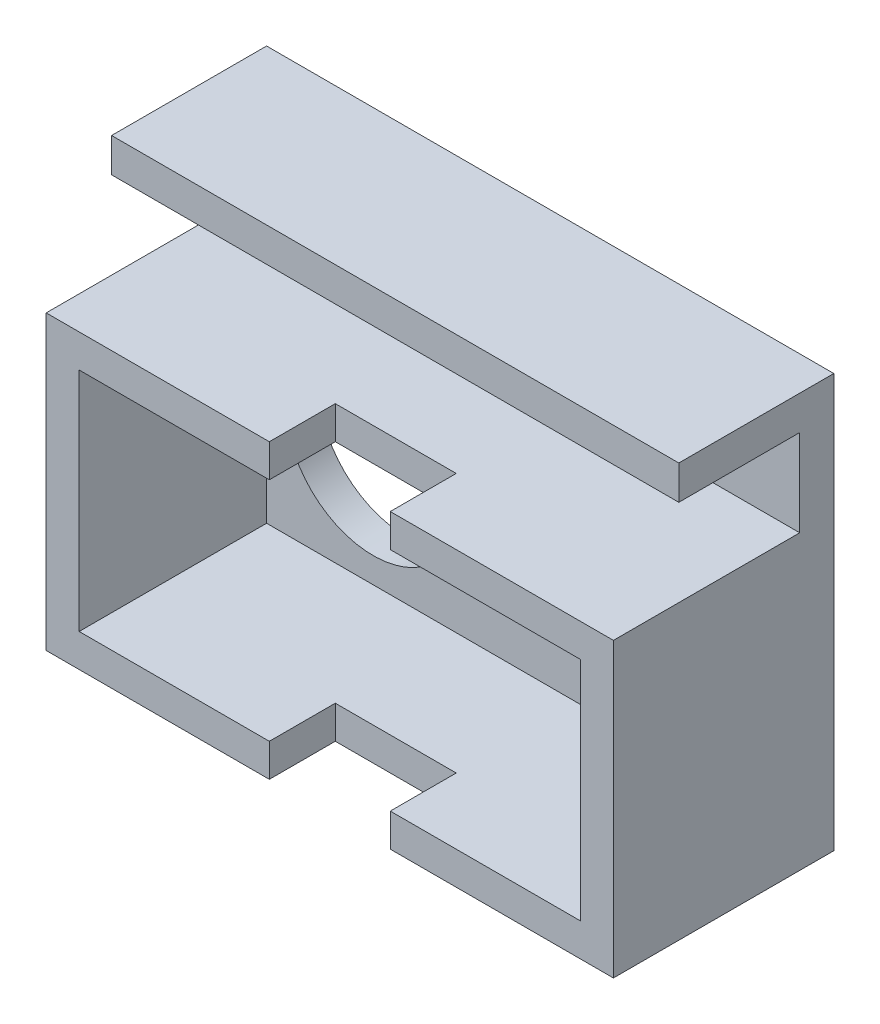
ISO-10303-21;
HEADER;
FILE_DESCRIPTION(('STEP AP214'),'2;1');
FILE_NAME('part.step','',(''),(''),'','','');
FILE_SCHEMA(('AUTOMOTIVE_DESIGN { 1 0 10303 214 1 1 1 1 }'));
ENDSEC;
DATA;
#1=APPLICATION_CONTEXT('core data for automotive mechanical design processes');
#2=APPLICATION_PROTOCOL_DEFINITION('international standard','automotive_design',2000,#1);
#3=PRODUCT_CONTEXT('',#1,'mechanical');
#4=PRODUCT('Part','Part','',(#3));
#5=PRODUCT_RELATED_PRODUCT_CATEGORY('part','',(#4));
#6=PRODUCT_DEFINITION_FORMATION('','',#4);
#7=PRODUCT_DEFINITION_CONTEXT('part definition',#1,'design');
#8=PRODUCT_DEFINITION('design','',#6,#7);
#9=PRODUCT_DEFINITION_SHAPE('','',#8);
#10=(LENGTH_UNIT() NAMED_UNIT(*) SI_UNIT(.MILLI.,.METRE.));
#11=(NAMED_UNIT(*) PLANE_ANGLE_UNIT() SI_UNIT($,.RADIAN.));
#12=(NAMED_UNIT(*) SI_UNIT($,.STERADIAN.) SOLID_ANGLE_UNIT());
#13=UNCERTAINTY_MEASURE_WITH_UNIT(LENGTH_MEASURE(1.E-05),#10,'distance_accuracy_value','');
#14=(GEOMETRIC_REPRESENTATION_CONTEXT(3) GLOBAL_UNCERTAINTY_ASSIGNED_CONTEXT((#13)) GLOBAL_UNIT_ASSIGNED_CONTEXT((#10,
#11,#12)) REPRESENTATION_CONTEXT('',''));
#15=CARTESIAN_POINT('',(0.,0.,0.));
#16=DIRECTION('',(0.,0.,1.));
#17=DIRECTION('',(1.,0.,0.));
#18=AXIS2_PLACEMENT_3D('',#15,#16,#17);
#19=CARTESIAN_POINT('',(0.,37.6,3.1));
#20=DIRECTION('',(0.,0.,-1.));
#21=DIRECTION('',(-1.,0.,0.));
#22=AXIS2_PLACEMENT_3D('',#19,#20,#21);
#23=PLANE('',#22);
#24=DIRECTION('',(1.,0.,0.));
#25=VECTOR('',#24,1.);
#26=CARTESIAN_POINT('',(0.,34.5,3.1));
#27=LINE('',#26,#25);
#28=CARTESIAN_POINT('',(0.,34.5,3.1));
#29=VERTEX_POINT('',#28);
#30=CARTESIAN_POINT('',(51.6,34.5,3.1));
#31=VERTEX_POINT('',#30);
#32=EDGE_CURVE('E278',#29,#31,#27,.T.);
#33=ORIENTED_EDGE('',*,*,#32,.F.);
#34=DIRECTION('',(0.,-1.,0.));
#35=VECTOR('',#34,1.);
#36=CARTESIAN_POINT('',(0.,37.6,3.1));
#37=LINE('',#36,#35);
#38=CARTESIAN_POINT('',(0.,26.6,3.1));
#39=VERTEX_POINT('',#38);
#40=EDGE_CURVE('E322',#29,#39,#37,.T.);
#41=ORIENTED_EDGE('',*,*,#40,.T.);
#42=DIRECTION('',(1.,0.,0.));
#43=VECTOR('',#42,1.);
#44=CARTESIAN_POINT('',(0.,26.6,3.1));
#45=LINE('',#44,#43);
#46=CARTESIAN_POINT('',(51.6,26.6,3.1));
#47=VERTEX_POINT('',#46);
#48=EDGE_CURVE('E303',#39,#47,#45,.T.);
#49=ORIENTED_EDGE('',*,*,#48,.T.);
#50=DIRECTION('',(0.,-1.,0.));
#51=VECTOR('',#50,1.);
#52=CARTESIAN_POINT('',(51.6,37.6,3.1));
#53=LINE('',#52,#51);
#54=EDGE_CURVE('E315',#31,#47,#53,.T.);
#55=ORIENTED_EDGE('',*,*,#54,.F.);
#56=EDGE_LOOP('',(#33,#41,#49,#55));
#57=FACE_BOUND('',#56,.T.);
#58=ADVANCED_FACE('F41',(#57),#23,.F.);
#59=CARTESIAN_POINT('',(0.,26.6,23.05));
#60=DIRECTION('',(0.,-1.,0.));
#61=DIRECTION('',(0.,0.,-1.));
#62=AXIS2_PLACEMENT_3D('',#59,#60,#61);
#63=PLANE('',#62);
#64=DIRECTION('',(0.,0.,-1.));
#65=VECTOR('',#64,1.);
#66=CARTESIAN_POINT('',(0.,26.6,23.05));
#67=LINE('',#66,#65);
#68=CARTESIAN_POINT('',(0.,26.6,20.05));
#69=VERTEX_POINT('',#68);
#70=EDGE_CURVE('E57',#69,#39,#67,.T.);
#71=ORIENTED_EDGE('',*,*,#70,.F.);
#72=DIRECTION('',(-1.,0.,0.));
#73=VECTOR('',#72,1.);
#74=CARTESIAN_POINT('',(0.,26.6,20.05));
#75=LINE('',#74,#73);
#76=CARTESIAN_POINT('',(20.3,26.6,20.05));
#77=VERTEX_POINT('',#76);
#78=EDGE_CURVE('E224',#77,#69,#75,.T.);
#79=ORIENTED_EDGE('',*,*,#78,.F.);
#80=DIRECTION('',(0.,0.,1.));
#81=VECTOR('',#80,1.);
#82=CARTESIAN_POINT('',(20.3,26.6,19.05));
#83=LINE('',#82,#81);
#84=CARTESIAN_POINT('',(20.3,26.6,14.05));
#85=VERTEX_POINT('',#84);
#86=EDGE_CURVE('E363',#85,#77,#83,.T.);
#87=ORIENTED_EDGE('',*,*,#86,.F.);
#88=DIRECTION('',(-1.,0.,0.));
#89=VECTOR('',#88,1.);
#90=CARTESIAN_POINT('',(31.3,26.6,14.05));
#91=LINE('',#90,#89);
#92=CARTESIAN_POINT('',(31.3,26.6,14.05));
#93=VERTEX_POINT('',#92);
#94=EDGE_CURVE('E262',#93,#85,#91,.T.);
#95=ORIENTED_EDGE('',*,*,#94,.F.);
#96=DIRECTION('',(0.,0.,1.));
#97=VECTOR('',#96,1.);
#98=CARTESIAN_POINT('',(31.3,26.6,19.05));
#99=LINE('',#98,#97);
#100=CARTESIAN_POINT('',(31.3,26.6,20.05));
#101=VERTEX_POINT('',#100);
#102=EDGE_CURVE('E366',#93,#101,#99,.T.);
#103=ORIENTED_EDGE('',*,*,#102,.T.);
#104=DIRECTION('',(-1.,0.,0.));
#105=VECTOR('',#104,1.);
#106=CARTESIAN_POINT('',(0.,26.6,20.05));
#107=LINE('',#106,#105);
#108=CARTESIAN_POINT('',(51.6,26.6,20.05));
#109=VERTEX_POINT('',#108);
#110=EDGE_CURVE('E254',#109,#101,#107,.T.);
#111=ORIENTED_EDGE('',*,*,#110,.F.);
#112=DIRECTION('',(0.,0.,-1.));
#113=VECTOR('',#112,1.);
#114=CARTESIAN_POINT('',(51.6,26.6,23.05));
#115=LINE('',#114,#113);
#116=EDGE_CURVE('E394',#109,#47,#115,.T.);
#117=ORIENTED_EDGE('',*,*,#116,.T.);
#118=ORIENTED_EDGE('',*,*,#48,.F.);
#119=EDGE_LOOP('',(#71,#79,#87,#95,#103,#111,#117,#118));
#120=FACE_BOUND('',#119,.T.);
#121=ADVANCED_FACE('F442',(#120),#63,.F.);
#122=CARTESIAN_POINT('',(0.,0.,23.05));
#123=DIRECTION('',(0.,1.,0.));
#124=DIRECTION('',(0.,0.,1.));
#125=AXIS2_PLACEMENT_3D('',#122,#123,#124);
#126=PLANE('',#125);
#127=DIRECTION('',(0.,0.,-1.));
#128=VECTOR('',#127,1.);
#129=CARTESIAN_POINT('',(51.6,0.,23.05));
#130=LINE('',#129,#128);
#131=CARTESIAN_POINT('',(51.6,0.,20.05));
#132=VERTEX_POINT('',#131);
#133=CARTESIAN_POINT('',(51.6,0.,0.));
#134=VERTEX_POINT('',#133);
#135=EDGE_CURVE('E65',#132,#134,#130,.T.);
#136=ORIENTED_EDGE('',*,*,#135,.F.);
#137=DIRECTION('',(-1.,0.,0.));
#138=VECTOR('',#137,1.);
#139=CARTESIAN_POINT('',(0.,0.,20.05));
#140=LINE('',#139,#138);
#141=CARTESIAN_POINT('',(31.3,0.,20.05));
#142=VERTEX_POINT('',#141);
#143=EDGE_CURVE('E245',#132,#142,#140,.T.);
#144=ORIENTED_EDGE('',*,*,#143,.T.);
#145=DIRECTION('',(0.,0.,1.));
#146=VECTOR('',#145,1.);
#147=CARTESIAN_POINT('',(31.3,0.,19.05));
#148=LINE('',#147,#146);
#149=CARTESIAN_POINT('',(31.3,0.,14.05));
#150=VERTEX_POINT('',#149);
#151=EDGE_CURVE('E350',#150,#142,#148,.T.);
#152=ORIENTED_EDGE('',*,*,#151,.F.);
#153=DIRECTION('',(1.,0.,0.));
#154=VECTOR('',#153,1.);
#155=CARTESIAN_POINT('',(31.3,0.,14.05));
#156=LINE('',#155,#154);
#157=CARTESIAN_POINT('',(20.3,0.,14.05));
#158=VERTEX_POINT('',#157);
#159=EDGE_CURVE('E186',#158,#150,#156,.T.);
#160=ORIENTED_EDGE('',*,*,#159,.F.);
#161=DIRECTION('',(0.,0.,1.));
#162=VECTOR('',#161,1.);
#163=CARTESIAN_POINT('',(20.3,0.,19.05));
#164=LINE('',#163,#162);
#165=CARTESIAN_POINT('',(20.3,0.,20.05));
#166=VERTEX_POINT('',#165);
#167=EDGE_CURVE('E180',#158,#166,#164,.T.);
#168=ORIENTED_EDGE('',*,*,#167,.T.);
#169=DIRECTION('',(1.,0.,0.));
#170=VECTOR('',#169,1.);
#171=CARTESIAN_POINT('',(0.,0.,20.05));
#172=LINE('',#171,#170);
#173=CARTESIAN_POINT('',(0.,0.,20.05));
#174=VERTEX_POINT('',#173);
#175=EDGE_CURVE('E184',#174,#166,#172,.T.);
#176=ORIENTED_EDGE('',*,*,#175,.F.);
#177=DIRECTION('',(0.,0.,-1.));
#178=VECTOR('',#177,1.);
#179=CARTESIAN_POINT('',(0.,0.,23.05));
#180=LINE('',#179,#178);
#181=CARTESIAN_POINT('',(0.,0.,0.));
#182=VERTEX_POINT('',#181);
#183=EDGE_CURVE('E50',#174,#182,#180,.T.);
#184=ORIENTED_EDGE('',*,*,#183,.T.);
#185=DIRECTION('',(1.,0.,0.));
#186=VECTOR('',#185,1.);
#187=CARTESIAN_POINT('',(0.,0.,0.));
#188=LINE('',#187,#186);
#189=EDGE_CURVE('E386',#182,#134,#188,.T.);
#190=ORIENTED_EDGE('',*,*,#189,.T.);
#191=EDGE_LOOP('',(#136,#144,#152,#160,#168,#176,#184,#190));
#192=FACE_BOUND('',#191,.T.);
#193=ADVANCED_FACE('F182',(#192),#126,.F.);
#194=CARTESIAN_POINT('',(0.,0.,23.05));
#195=DIRECTION('',(1.,0.,0.));
#196=DIRECTION('',(0.,0.,-1.));
#197=AXIS2_PLACEMENT_3D('',#194,#195,#196);
#198=PLANE('',#197);
#199=ORIENTED_EDGE('',*,*,#183,.F.);
#200=DIRECTION('',(0.,-1.,0.));
#201=VECTOR('',#200,1.);
#202=CARTESIAN_POINT('',(0.,0.,20.05));
#203=LINE('',#202,#201);
#204=EDGE_CURVE('E206',#69,#174,#203,.T.);
#205=ORIENTED_EDGE('',*,*,#204,.F.);
#206=ORIENTED_EDGE('',*,*,#70,.T.);
#207=ORIENTED_EDGE('',*,*,#40,.F.);
#208=DIRECTION('',(0.,0.,-1.));
#209=VECTOR('',#208,1.);
#210=CARTESIAN_POINT('',(0.,34.5,14.1));
#211=LINE('',#210,#209);
#212=CARTESIAN_POINT('',(0.,34.5,14.1));
#213=VERTEX_POINT('',#212);
#214=EDGE_CURVE('E300',#213,#29,#211,.T.);
#215=ORIENTED_EDGE('',*,*,#214,.F.);
#216=DIRECTION('',(0.,-1.,0.));
#217=VECTOR('',#216,1.);
#218=CARTESIAN_POINT('',(0.,37.6,14.1));
#219=LINE('',#218,#217);
#220=CARTESIAN_POINT('',(0.,37.6,14.1));
#221=VERTEX_POINT('',#220);
#222=EDGE_CURVE('E279',#221,#213,#219,.T.);
#223=ORIENTED_EDGE('',*,*,#222,.F.);
#224=DIRECTION('',(0.,0.,1.));
#225=VECTOR('',#224,1.);
#226=CARTESIAN_POINT('',(0.,37.6,0.));
#227=LINE('',#226,#225);
#228=CARTESIAN_POINT('',(0.,37.6,0.));
#229=VERTEX_POINT('',#228);
#230=EDGE_CURVE('E304',#229,#221,#227,.T.);
#231=ORIENTED_EDGE('',*,*,#230,.F.);
#232=DIRECTION('',(0.,-1.,0.));
#233=VECTOR('',#232,1.);
#234=CARTESIAN_POINT('',(0.,0.,0.));
#235=LINE('',#234,#233);
#236=EDGE_CURVE('E191',#229,#182,#235,.T.);
#237=ORIENTED_EDGE('',*,*,#236,.T.);
#238=EDGE_LOOP('',(#199,#205,#206,#207,#215,#223,#231,#237));
#239=FACE_BOUND('',#238,.T.);
#240=ADVANCED_FACE('F43',(#239),#198,.F.);
#241=CARTESIAN_POINT('',(51.6,0.,23.05));
#242=DIRECTION('',(-1.,0.,0.));
#243=DIRECTION('',(0.,0.,1.));
#244=AXIS2_PLACEMENT_3D('',#241,#242,#243);
#245=PLANE('',#244);
#246=ORIENTED_EDGE('',*,*,#116,.F.);
#247=DIRECTION('',(0.,1.,0.));
#248=VECTOR('',#247,1.);
#249=CARTESIAN_POINT('',(51.6,0.,20.05));
#250=LINE('',#249,#248);
#251=EDGE_CURVE('E250',#132,#109,#250,.T.);
#252=ORIENTED_EDGE('',*,*,#251,.F.);
#253=ORIENTED_EDGE('',*,*,#135,.T.);
#254=DIRECTION('',(0.,1.,0.));
#255=VECTOR('',#254,1.);
#256=CARTESIAN_POINT('',(51.6,0.,0.));
#257=LINE('',#256,#255);
#258=CARTESIAN_POINT('',(51.6,37.6,0.));
#259=VERTEX_POINT('',#258);
#260=EDGE_CURVE('E389',#134,#259,#257,.T.);
#261=ORIENTED_EDGE('',*,*,#260,.T.);
#262=DIRECTION('',(0.,0.,-1.));
#263=VECTOR('',#262,1.);
#264=CARTESIAN_POINT('',(51.6,37.6,0.));
#265=LINE('',#264,#263);
#266=CARTESIAN_POINT('',(51.6,37.6,14.1));
#267=VERTEX_POINT('',#266);
#268=EDGE_CURVE('E307',#267,#259,#265,.T.);
#269=ORIENTED_EDGE('',*,*,#268,.F.);
#270=DIRECTION('',(0.,1.,0.));
#271=VECTOR('',#270,1.);
#272=CARTESIAN_POINT('',(51.6,37.6,14.1));
#273=LINE('',#272,#271);
#274=CARTESIAN_POINT('',(51.6,34.5,14.1));
#275=VERTEX_POINT('',#274);
#276=EDGE_CURVE('E286',#275,#267,#273,.T.);
#277=ORIENTED_EDGE('',*,*,#276,.F.);
#278=DIRECTION('',(0.,0.,-1.));
#279=VECTOR('',#278,1.);
#280=CARTESIAN_POINT('',(51.6,34.5,14.1));
#281=LINE('',#280,#279);
#282=EDGE_CURVE('E294',#275,#31,#281,.T.);
#283=ORIENTED_EDGE('',*,*,#282,.T.);
#284=ORIENTED_EDGE('',*,*,#54,.T.);
#285=EDGE_LOOP('',(#246,#252,#253,#261,#269,#277,#283,#284));
#286=FACE_BOUND('',#285,.T.);
#287=ADVANCED_FACE('F450',(#286),#245,.F.);
#288=CARTESIAN_POINT('',(0.,0.,0.));
#289=DIRECTION('',(0.,0.,-1.));
#290=DIRECTION('',(-1.,0.,0.));
#291=AXIS2_PLACEMENT_3D('',#288,#289,#290);
#292=PLANE('',#291);
#293=CARTESIAN_POINT('',(38.9,13.3,0.));
#294=DIRECTION('',(0.,0.,-1.));
#295=DIRECTION('',(-1.,0.,0.));
#296=AXIS2_PLACEMENT_3D('',#293,#294,#295);
#297=CIRCLE('',#296,8.);
#298=CARTESIAN_POINT('',(30.9,13.3,0.));
#299=VERTEX_POINT('',#298);
#300=EDGE_CURVE('E326',#299,#299,#297,.T.);
#301=ORIENTED_EDGE('',*,*,#300,.F.);
#302=EDGE_LOOP('',(#301));
#303=FACE_BOUND('',#302,.T.);
#304=CARTESIAN_POINT('',(12.7,13.3,0.));
#305=DIRECTION('',(0.,0.,-1.));
#306=DIRECTION('',(-1.,0.,0.));
#307=AXIS2_PLACEMENT_3D('',#304,#305,#306);
#308=CIRCLE('',#307,8.);
#309=CARTESIAN_POINT('',(4.7,13.3,0.));
#310=VERTEX_POINT('',#309);
#311=EDGE_CURVE('E325',#310,#310,#308,.T.);
#312=ORIENTED_EDGE('',*,*,#311,.F.);
#313=EDGE_LOOP('',(#312));
#314=FACE_BOUND('',#313,.T.);
#315=ORIENTED_EDGE('',*,*,#236,.F.);
#316=DIRECTION('',(-1.,0.,0.));
#317=VECTOR('',#316,1.);
#318=CARTESIAN_POINT('',(0.,37.6,0.));
#319=LINE('',#318,#317);
#320=EDGE_CURVE('E311',#259,#229,#319,.T.);
#321=ORIENTED_EDGE('',*,*,#320,.F.);
#322=ORIENTED_EDGE('',*,*,#260,.F.);
#323=ORIENTED_EDGE('',*,*,#189,.F.);
#324=EDGE_LOOP('',(#315,#321,#322,#323));
#325=FACE_BOUND('',#324,.T.);
#326=ADVANCED_FACE('F448',(#303,#314,#325),#292,.T.);
#327=CARTESIAN_POINT('',(20.3,0.,19.05));
#328=DIRECTION('',(1.,0.,0.));
#329=DIRECTION('',(0.,0.,-1.));
#330=AXIS2_PLACEMENT_3D('',#327,#328,#329);
#331=PLANE('',#330);
#332=DIRECTION('',(0.,0.,1.));
#333=VECTOR('',#332,1.);
#334=CARTESIAN_POINT('',(20.3,3.,19.05));
#335=LINE('',#334,#333);
#336=CARTESIAN_POINT('',(20.3,3.,14.05));
#337=VERTEX_POINT('',#336);
#338=CARTESIAN_POINT('',(20.3,3.,20.05));
#339=VERTEX_POINT('',#338);
#340=EDGE_CURVE('E192',#337,#339,#335,.T.);
#341=ORIENTED_EDGE('',*,*,#340,.T.);
#342=DIRECTION('',(0.,1.,0.));
#343=VECTOR('',#342,1.);
#344=CARTESIAN_POINT('',(20.3,0.,20.05));
#345=LINE('',#344,#343);
#346=EDGE_CURVE('E195',#166,#339,#345,.T.);
#347=ORIENTED_EDGE('',*,*,#346,.F.);
#348=ORIENTED_EDGE('',*,*,#167,.F.);
#349=DIRECTION('',(0.,-1.,0.));
#350=VECTOR('',#349,1.);
#351=CARTESIAN_POINT('',(20.3,0.,14.05));
#352=LINE('',#351,#350);
#353=EDGE_CURVE('E267',#337,#158,#352,.T.);
#354=ORIENTED_EDGE('',*,*,#353,.F.);
#355=EDGE_LOOP('',(#341,#347,#348,#354));
#356=FACE_BOUND('',#355,.T.);
#357=ADVANCED_FACE('F196',(#356),#331,.T.);
#358=CARTESIAN_POINT('',(0.,3.,19.05));
#359=DIRECTION('',(0.,-1.,0.));
#360=DIRECTION('',(0.,0.,-1.));
#361=AXIS2_PLACEMENT_3D('',#358,#359,#360);
#362=PLANE('',#361);
#363=DIRECTION('',(0.,0.,1.));
#364=VECTOR('',#363,1.);
#365=CARTESIAN_POINT('',(3.,3.,19.05));
#366=LINE('',#365,#364);
#367=CARTESIAN_POINT('',(3.,3.,3.));
#368=VERTEX_POINT('',#367);
#369=CARTESIAN_POINT('',(3.,3.,20.05));
#370=VERTEX_POINT('',#369);
#371=EDGE_CURVE('E354',#368,#370,#366,.T.);
#372=ORIENTED_EDGE('',*,*,#371,.T.);
#373=DIRECTION('',(-1.,0.,0.));
#374=VECTOR('',#373,1.);
#375=CARTESIAN_POINT('',(0.,3.,20.05));
#376=LINE('',#375,#374);
#377=EDGE_CURVE('E201',#339,#370,#376,.T.);
#378=ORIENTED_EDGE('',*,*,#377,.F.);
#379=ORIENTED_EDGE('',*,*,#340,.F.);
#380=DIRECTION('',(-1.,0.,0.));
#381=VECTOR('',#380,1.);
#382=CARTESIAN_POINT('',(0.,3.,14.05));
#383=LINE('',#382,#381);
#384=CARTESIAN_POINT('',(31.3,3.,14.05));
#385=VERTEX_POINT('',#384);
#386=EDGE_CURVE('E274',#385,#337,#383,.T.);
#387=ORIENTED_EDGE('',*,*,#386,.F.);
#388=DIRECTION('',(0.,0.,1.));
#389=VECTOR('',#388,1.);
#390=CARTESIAN_POINT('',(31.3,3.,19.05));
#391=LINE('',#390,#389);
#392=CARTESIAN_POINT('',(31.3,3.,20.05));
#393=VERTEX_POINT('',#392);
#394=EDGE_CURVE('E378',#385,#393,#391,.T.);
#395=ORIENTED_EDGE('',*,*,#394,.T.);
#396=DIRECTION('',(-1.,0.,0.));
#397=VECTOR('',#396,1.);
#398=CARTESIAN_POINT('',(0.,3.,20.05));
#399=LINE('',#398,#397);
#400=CARTESIAN_POINT('',(48.6,3.,20.05));
#401=VERTEX_POINT('',#400);
#402=EDGE_CURVE('E237',#401,#393,#399,.T.);
#403=ORIENTED_EDGE('',*,*,#402,.F.);
#404=DIRECTION('',(0.,0.,1.));
#405=VECTOR('',#404,1.);
#406=CARTESIAN_POINT('',(48.6,3.,19.05));
#407=LINE('',#406,#405);
#408=CARTESIAN_POINT('',(48.6,3.,3.));
#409=VERTEX_POINT('',#408);
#410=EDGE_CURVE('E375',#409,#401,#407,.T.);
#411=ORIENTED_EDGE('',*,*,#410,.F.);
#412=DIRECTION('',(1.,0.,0.));
#413=VECTOR('',#412,1.);
#414=CARTESIAN_POINT('',(3.,3.,3.));
#415=LINE('',#414,#413);
#416=EDGE_CURVE('E338',#368,#409,#415,.T.);
#417=ORIENTED_EDGE('',*,*,#416,.F.);
#418=EDGE_LOOP('',(#372,#378,#379,#387,#395,#403,#411,#417));
#419=FACE_BOUND('',#418,.T.);
#420=ADVANCED_FACE('F425',(#419),#362,.F.);
#421=CARTESIAN_POINT('',(3.,0.,19.05));
#422=DIRECTION('',(-1.,0.,0.));
#423=DIRECTION('',(0.,0.,1.));
#424=AXIS2_PLACEMENT_3D('',#421,#422,#423);
#425=PLANE('',#424);
#426=DIRECTION('',(0.,0.,1.));
#427=VECTOR('',#426,1.);
#428=CARTESIAN_POINT('',(3.,23.6,19.05));
#429=LINE('',#428,#427);
#430=CARTESIAN_POINT('',(3.,23.6,3.));
#431=VERTEX_POINT('',#430);
#432=CARTESIAN_POINT('',(3.,23.6,20.05));
#433=VERTEX_POINT('',#432);
#434=EDGE_CURVE('E357',#431,#433,#429,.T.);
#435=ORIENTED_EDGE('',*,*,#434,.T.);
#436=DIRECTION('',(0.,1.,0.));
#437=VECTOR('',#436,1.);
#438=CARTESIAN_POINT('',(3.,0.,20.05));
#439=LINE('',#438,#437);
#440=EDGE_CURVE('E212',#370,#433,#439,.T.);
#441=ORIENTED_EDGE('',*,*,#440,.F.);
#442=ORIENTED_EDGE('',*,*,#371,.F.);
#443=DIRECTION('',(0.,-1.,0.));
#444=VECTOR('',#443,1.);
#445=CARTESIAN_POINT('',(3.,23.6,3.));
#446=LINE('',#445,#444);
#447=EDGE_CURVE('E334',#431,#368,#446,.T.);
#448=ORIENTED_EDGE('',*,*,#447,.F.);
#449=EDGE_LOOP('',(#435,#441,#442,#448));
#450=FACE_BOUND('',#449,.T.);
#451=ADVANCED_FACE('F422',(#450),#425,.F.);
#452=CARTESIAN_POINT('',(0.,23.6,19.05));
#453=DIRECTION('',(0.,-1.,0.));
#454=DIRECTION('',(0.,0.,-1.));
#455=AXIS2_PLACEMENT_3D('',#452,#453,#454);
#456=PLANE('',#455);
#457=DIRECTION('',(0.,0.,1.));
#458=VECTOR('',#457,1.);
#459=CARTESIAN_POINT('',(20.3,23.6,19.05));
#460=LINE('',#459,#458);
#461=CARTESIAN_POINT('',(20.3,23.6,14.05));
#462=VERTEX_POINT('',#461);
#463=CARTESIAN_POINT('',(20.3,23.6,20.05));
#464=VERTEX_POINT('',#463);
#465=EDGE_CURVE('E360',#462,#464,#460,.T.);
#466=ORIENTED_EDGE('',*,*,#465,.T.);
#467=DIRECTION('',(1.,0.,0.));
#468=VECTOR('',#467,1.);
#469=CARTESIAN_POINT('',(0.,23.6,20.05));
#470=LINE('',#469,#468);
#471=EDGE_CURVE('E216',#433,#464,#470,.T.);
#472=ORIENTED_EDGE('',*,*,#471,.F.);
#473=ORIENTED_EDGE('',*,*,#434,.F.);
#474=DIRECTION('',(-1.,0.,0.));
#475=VECTOR('',#474,1.);
#476=CARTESIAN_POINT('',(3.,23.6,3.));
#477=LINE('',#476,#475);
#478=CARTESIAN_POINT('',(48.6,23.6,3.));
#479=VERTEX_POINT('',#478);
#480=EDGE_CURVE('E347',#479,#431,#477,.T.);
#481=ORIENTED_EDGE('',*,*,#480,.F.);
#482=DIRECTION('',(0.,0.,1.));
#483=VECTOR('',#482,1.);
#484=CARTESIAN_POINT('',(48.6,23.6,19.05));
#485=LINE('',#484,#483);
#486=CARTESIAN_POINT('',(48.6,23.6,20.05));
#487=VERTEX_POINT('',#486);
#488=EDGE_CURVE('E372',#479,#487,#485,.T.);
#489=ORIENTED_EDGE('',*,*,#488,.T.);
#490=DIRECTION('',(-1.,0.,0.));
#491=VECTOR('',#490,1.);
#492=CARTESIAN_POINT('',(0.,23.6,20.05));
#493=LINE('',#492,#491);
#494=CARTESIAN_POINT('',(31.3,23.6,20.05));
#495=VERTEX_POINT('',#494);
#496=EDGE_CURVE('E229',#487,#495,#493,.T.);
#497=ORIENTED_EDGE('',*,*,#496,.T.);
#498=DIRECTION('',(0.,0.,1.));
#499=VECTOR('',#498,1.);
#500=CARTESIAN_POINT('',(31.3,23.6,19.05));
#501=LINE('',#500,#499);
#502=CARTESIAN_POINT('',(31.3,23.6,14.05));
#503=VERTEX_POINT('',#502);
#504=EDGE_CURVE('E369',#503,#495,#501,.T.);
#505=ORIENTED_EDGE('',*,*,#504,.F.);
#506=DIRECTION('',(-1.,0.,0.));
#507=VECTOR('',#506,1.);
#508=CARTESIAN_POINT('',(0.,23.6,14.05));
#509=LINE('',#508,#507);
#510=EDGE_CURVE('E11',#503,#462,#509,.T.);
#511=ORIENTED_EDGE('',*,*,#510,.T.);
#512=EDGE_LOOP('',(#466,#472,#473,#481,#489,#497,#505,#511));
#513=FACE_BOUND('',#512,.T.);
#514=ADVANCED_FACE('F432',(#513),#456,.T.);
#515=CARTESIAN_POINT('',(20.3,0.,19.05));
#516=DIRECTION('',(1.,0.,0.));
#517=DIRECTION('',(0.,0.,-1.));
#518=AXIS2_PLACEMENT_3D('',#515,#516,#517);
#519=PLANE('',#518);
#520=ORIENTED_EDGE('',*,*,#86,.T.);
#521=DIRECTION('',(0.,1.,0.));
#522=VECTOR('',#521,1.);
#523=CARTESIAN_POINT('',(20.3,0.,20.05));
#524=LINE('',#523,#522);
#525=EDGE_CURVE('E220',#464,#77,#524,.T.);
#526=ORIENTED_EDGE('',*,*,#525,.F.);
#527=ORIENTED_EDGE('',*,*,#465,.F.);
#528=EDGE_CURVE('E268',#85,#462,#352,.T.);
#529=ORIENTED_EDGE('',*,*,#528,.F.);
#530=EDGE_LOOP('',(#520,#526,#527,#529));
#531=FACE_BOUND('',#530,.T.);
#532=ADVANCED_FACE('F438',(#531),#519,.T.);
#533=CARTESIAN_POINT('',(31.3,0.,19.05));
#534=DIRECTION('',(1.,0.,0.));
#535=DIRECTION('',(0.,0.,-1.));
#536=AXIS2_PLACEMENT_3D('',#533,#534,#535);
#537=PLANE('',#536);
#538=ORIENTED_EDGE('',*,*,#504,.T.);
#539=DIRECTION('',(0.,1.,0.));
#540=VECTOR('',#539,1.);
#541=CARTESIAN_POINT('',(31.3,0.,20.05));
#542=LINE('',#541,#540);
#543=EDGE_CURVE('E246',#495,#101,#542,.T.);
#544=ORIENTED_EDGE('',*,*,#543,.T.);
#545=ORIENTED_EDGE('',*,*,#102,.F.);
#546=DIRECTION('',(0.,1.,0.));
#547=VECTOR('',#546,1.);
#548=CARTESIAN_POINT('',(31.3,0.,14.05));
#549=LINE('',#548,#547);
#550=EDGE_CURVE('E263',#503,#93,#549,.T.);
#551=ORIENTED_EDGE('',*,*,#550,.F.);
#552=EDGE_LOOP('',(#538,#544,#545,#551));
#553=FACE_BOUND('',#552,.T.);
#554=ADVANCED_FACE('F475',(#553),#537,.F.);
#555=CARTESIAN_POINT('',(48.6,0.,19.05));
#556=DIRECTION('',(-1.,0.,0.));
#557=DIRECTION('',(0.,0.,1.));
#558=AXIS2_PLACEMENT_3D('',#555,#556,#557);
#559=PLANE('',#558);
#560=ORIENTED_EDGE('',*,*,#410,.T.);
#561=DIRECTION('',(0.,1.,0.));
#562=VECTOR('',#561,1.);
#563=CARTESIAN_POINT('',(48.6,0.,20.05));
#564=LINE('',#563,#562);
#565=EDGE_CURVE('E233',#401,#487,#564,.T.);
#566=ORIENTED_EDGE('',*,*,#565,.T.);
#567=ORIENTED_EDGE('',*,*,#488,.F.);
#568=DIRECTION('',(0.,1.,0.));
#569=VECTOR('',#568,1.);
#570=CARTESIAN_POINT('',(48.6,23.6,3.));
#571=LINE('',#570,#569);
#572=EDGE_CURVE('E343',#409,#479,#571,.T.);
#573=ORIENTED_EDGE('',*,*,#572,.F.);
#574=EDGE_LOOP('',(#560,#566,#567,#573));
#575=FACE_BOUND('',#574,.T.);
#576=ADVANCED_FACE('F430',(#575),#559,.T.);
#577=CARTESIAN_POINT('',(31.3,0.,19.05));
#578=DIRECTION('',(1.,0.,0.));
#579=DIRECTION('',(0.,0.,-1.));
#580=AXIS2_PLACEMENT_3D('',#577,#578,#579);
#581=PLANE('',#580);
#582=ORIENTED_EDGE('',*,*,#151,.T.);
#583=EDGE_CURVE('E241',#142,#393,#542,.T.);
#584=ORIENTED_EDGE('',*,*,#583,.T.);
#585=ORIENTED_EDGE('',*,*,#394,.F.);
#586=EDGE_CURVE('E258',#150,#385,#549,.T.);
#587=ORIENTED_EDGE('',*,*,#586,.F.);
#588=EDGE_LOOP('',(#582,#584,#585,#587));
#589=FACE_BOUND('',#588,.T.);
#590=ADVANCED_FACE('F414',(#589),#581,.F.);
#591=CARTESIAN_POINT('',(0.,0.,3.));
#592=DIRECTION('',(0.,0.,1.));
#593=DIRECTION('',(1.,0.,0.));
#594=AXIS2_PLACEMENT_3D('',#591,#592,#593);
#595=PLANE('',#594);
#596=CARTESIAN_POINT('',(38.9,13.3,3.));
#597=DIRECTION('',(0.,0.,1.));
#598=DIRECTION('',(1.,0.,0.));
#599=AXIS2_PLACEMENT_3D('',#596,#597,#598);
#600=CIRCLE('',#599,8.);
#601=CARTESIAN_POINT('',(30.9,13.3,3.));
#602=VERTEX_POINT('',#601);
#603=EDGE_CURVE('E339',#602,#602,#600,.T.);
#604=ORIENTED_EDGE('',*,*,#603,.F.);
#605=EDGE_LOOP('',(#604));
#606=FACE_BOUND('',#605,.T.);
#607=CARTESIAN_POINT('',(12.7,13.3,3.));
#608=DIRECTION('',(0.,0.,1.));
#609=DIRECTION('',(1.,0.,0.));
#610=AXIS2_PLACEMENT_3D('',#607,#608,#609);
#611=CIRCLE('',#610,8.);
#612=CARTESIAN_POINT('',(4.7,13.3,3.));
#613=VERTEX_POINT('',#612);
#614=EDGE_CURVE('E330',#613,#613,#611,.T.);
#615=ORIENTED_EDGE('',*,*,#614,.F.);
#616=EDGE_LOOP('',(#615));
#617=FACE_BOUND('',#616,.T.);
#618=ORIENTED_EDGE('',*,*,#447,.T.);
#619=ORIENTED_EDGE('',*,*,#416,.T.);
#620=ORIENTED_EDGE('',*,*,#572,.T.);
#621=ORIENTED_EDGE('',*,*,#480,.T.);
#622=EDGE_LOOP('',(#618,#619,#620,#621));
#623=FACE_BOUND('',#622,.T.);
#624=ADVANCED_FACE('F410',(#606,#617,#623),#595,.T.);
#625=CARTESIAN_POINT('',(12.7,13.3,3.1));
#626=DIRECTION('',(0.,0.,-1.));
#627=DIRECTION('',(-1.,0.,0.));
#628=AXIS2_PLACEMENT_3D('',#625,#626,#627);
#629=CYLINDRICAL_SURFACE('',#628,8.);
#630=CARTESIAN_POINT('',(4.7,13.3,3.));
#631=CARTESIAN_POINT('',(4.7,13.3,2.96875));
#632=CARTESIAN_POINT('',(4.7,13.3,2.9375));
#633=CARTESIAN_POINT('',(4.7,13.3,2.875));
#634=CARTESIAN_POINT('',(4.7,13.3,2.84375));
#635=CARTESIAN_POINT('',(4.7,13.3,2.78125));
#636=CARTESIAN_POINT('',(4.7,13.3,2.75));
#637=CARTESIAN_POINT('',(4.7,13.3,2.6875));
#638=CARTESIAN_POINT('',(4.7,13.3,2.65625));
#639=CARTESIAN_POINT('',(4.7,13.3,2.59375));
#640=CARTESIAN_POINT('',(4.7,13.3,2.5625));
#641=CARTESIAN_POINT('',(4.7,13.3,2.5));
#642=CARTESIAN_POINT('',(4.7,13.3,2.46875));
#643=CARTESIAN_POINT('',(4.7,13.3,2.40625));
#644=CARTESIAN_POINT('',(4.7,13.3,2.375));
#645=CARTESIAN_POINT('',(4.7,13.3,2.3125));
#646=CARTESIAN_POINT('',(4.7,13.3,2.28125));
#647=CARTESIAN_POINT('',(4.7,13.3,2.21875));
#648=CARTESIAN_POINT('',(4.7,13.3,2.1875));
#649=CARTESIAN_POINT('',(4.7,13.3,2.125));
#650=CARTESIAN_POINT('',(4.7,13.3,2.09375));
#651=CARTESIAN_POINT('',(4.7,13.3,2.03125));
#652=CARTESIAN_POINT('',(4.7,13.3,2.));
#653=CARTESIAN_POINT('',(4.7,13.3,1.9375));
#654=CARTESIAN_POINT('',(4.7,13.3,1.90625));
#655=CARTESIAN_POINT('',(4.7,13.3,1.84375));
#656=CARTESIAN_POINT('',(4.7,13.3,1.8125));
#657=CARTESIAN_POINT('',(4.7,13.3,1.75));
#658=CARTESIAN_POINT('',(4.7,13.3,1.71875));
#659=CARTESIAN_POINT('',(4.7,13.3,1.65625));
#660=CARTESIAN_POINT('',(4.7,13.3,1.625));
#661=CARTESIAN_POINT('',(4.7,13.3,1.5625));
#662=CARTESIAN_POINT('',(4.7,13.3,1.53125));
#663=CARTESIAN_POINT('',(4.7,13.3,1.46875));
#664=CARTESIAN_POINT('',(4.7,13.3,1.4375));
#665=CARTESIAN_POINT('',(4.7,13.3,1.375));
#666=CARTESIAN_POINT('',(4.7,13.3,1.34375));
#667=CARTESIAN_POINT('',(4.7,13.3,1.28125));
#668=CARTESIAN_POINT('',(4.7,13.3,1.25));
#669=CARTESIAN_POINT('',(4.7,13.3,1.1875));
#670=CARTESIAN_POINT('',(4.7,13.3,1.15625));
#671=CARTESIAN_POINT('',(4.7,13.3,1.09375));
#672=CARTESIAN_POINT('',(4.7,13.3,1.0625));
#673=CARTESIAN_POINT('',(4.7,13.3,1.));
#674=CARTESIAN_POINT('',(4.7,13.3,0.96875));
#675=CARTESIAN_POINT('',(4.7,13.3,0.90625));
#676=CARTESIAN_POINT('',(4.7,13.3,0.875));
#677=CARTESIAN_POINT('',(4.7,13.3,0.8125));
#678=CARTESIAN_POINT('',(4.7,13.3,0.78125));
#679=CARTESIAN_POINT('',(4.7,13.3,0.71875));
#680=CARTESIAN_POINT('',(4.7,13.3,0.6875));
#681=CARTESIAN_POINT('',(4.7,13.3,0.625));
#682=CARTESIAN_POINT('',(4.7,13.3,0.59375));
#683=CARTESIAN_POINT('',(4.7,13.3,0.53125));
#684=CARTESIAN_POINT('',(4.7,13.3,0.5));
#685=CARTESIAN_POINT('',(4.7,13.3,0.4375));
#686=CARTESIAN_POINT('',(4.7,13.3,0.40625));
#687=CARTESIAN_POINT('',(4.7,13.3,0.34375));
#688=CARTESIAN_POINT('',(4.7,13.3,0.3125));
#689=CARTESIAN_POINT('',(4.7,13.3,0.25));
#690=CARTESIAN_POINT('',(4.7,13.3,0.21875));
#691=CARTESIAN_POINT('',(4.7,13.3,0.15625));
#692=CARTESIAN_POINT('',(4.7,13.3,0.125));
#693=CARTESIAN_POINT('',(4.7,13.3,0.0625000000000001));
#694=CARTESIAN_POINT('',(4.7,13.3,0.03125));
#695=CARTESIAN_POINT('',(4.7,13.3,0.));
#696=B_SPLINE_CURVE_WITH_KNOTS('',3,(#630,#631,#632,#633,#634,#635,#636,#637,#638,#639,#640,
#641,#642,#643,#644,#645,#646,#647,#648,#649,#650,#651,#652,#653,#654,#655,#656,#657,#658,#659,
#660,#661,#662,#663,#664,#665,#666,#667,#668,#669,#670,#671,#672,#673,#674,#675,#676,#677,#678,
#679,#680,#681,#682,#683,#684,#685,#686,#687,#688,#689,#690,#691,#692,#693,#694,#695),
.UNSPECIFIED.,.F.,.F.,(4,2,2,2,2,2,2,2,2,2,2,2,2,2,2,2,2,2,2,2,2,2,2,2,2,2,2,2,2,2,2,2,4),(0.,
0.0937499999999997,0.1875,0.28125,0.374999999999999,0.46875,0.5625,0.656249999999999,
0.749999999999999,0.843749999999999,0.9375,1.03125,1.125,1.21875,1.3125,1.40625,1.5,1.59375,
1.6875,1.78125,1.875,1.96875,2.0625,2.15625,2.25,2.34375,2.4375,2.53125,2.625,2.71875,2.8125,
2.90625,3.),.UNSPECIFIED.);
#697=EDGE_CURVE('BSEAM413',#613,#310,#696,.T.);
#698=ORIENTED_EDGE('',*,*,#614,.T.);
#699=ORIENTED_EDGE('',*,*,#311,.T.);
#700=ORIENTED_EDGE('',*,*,#697,.T.);
#701=ORIENTED_EDGE('',*,*,#697,.F.);
#702=EDGE_LOOP('',(#698,#700,#699,#701));
#703=FACE_BOUND('',#702,.T.);
#704=ADVANCED_FACE('F413',(#703),#629,.F.);
#705=CARTESIAN_POINT('',(38.9,13.3,3.1));
#706=DIRECTION('',(0.,0.,-1.));
#707=DIRECTION('',(-1.,0.,0.));
#708=AXIS2_PLACEMENT_3D('',#705,#706,#707);
#709=CYLINDRICAL_SURFACE('',#708,8.);
#710=CARTESIAN_POINT('',(30.9,13.3,3.));
#711=CARTESIAN_POINT('',(30.9,13.3,2.96875));
#712=CARTESIAN_POINT('',(30.9,13.3,2.9375));
#713=CARTESIAN_POINT('',(30.9,13.3,2.875));
#714=CARTESIAN_POINT('',(30.9,13.3,2.84375));
#715=CARTESIAN_POINT('',(30.9,13.3,2.78125));
#716=CARTESIAN_POINT('',(30.9,13.3,2.75));
#717=CARTESIAN_POINT('',(30.9,13.3,2.6875));
#718=CARTESIAN_POINT('',(30.9,13.3,2.65625));
#719=CARTESIAN_POINT('',(30.9,13.3,2.59375));
#720=CARTESIAN_POINT('',(30.9,13.3,2.5625));
#721=CARTESIAN_POINT('',(30.9,13.3,2.5));
#722=CARTESIAN_POINT('',(30.9,13.3,2.46875));
#723=CARTESIAN_POINT('',(30.9,13.3,2.40625));
#724=CARTESIAN_POINT('',(30.9,13.3,2.375));
#725=CARTESIAN_POINT('',(30.9,13.3,2.3125));
#726=CARTESIAN_POINT('',(30.9,13.3,2.28125));
#727=CARTESIAN_POINT('',(30.9,13.3,2.21875));
#728=CARTESIAN_POINT('',(30.9,13.3,2.1875));
#729=CARTESIAN_POINT('',(30.9,13.3,2.125));
#730=CARTESIAN_POINT('',(30.9,13.3,2.09375));
#731=CARTESIAN_POINT('',(30.9,13.3,2.03125));
#732=CARTESIAN_POINT('',(30.9,13.3,2.));
#733=CARTESIAN_POINT('',(30.9,13.3,1.9375));
#734=CARTESIAN_POINT('',(30.9,13.3,1.90625));
#735=CARTESIAN_POINT('',(30.9,13.3,1.84375));
#736=CARTESIAN_POINT('',(30.9,13.3,1.8125));
#737=CARTESIAN_POINT('',(30.9,13.3,1.75));
#738=CARTESIAN_POINT('',(30.9,13.3,1.71875));
#739=CARTESIAN_POINT('',(30.9,13.3,1.65625));
#740=CARTESIAN_POINT('',(30.9,13.3,1.625));
#741=CARTESIAN_POINT('',(30.9,13.3,1.5625));
#742=CARTESIAN_POINT('',(30.9,13.3,1.53125));
#743=CARTESIAN_POINT('',(30.9,13.3,1.46875));
#744=CARTESIAN_POINT('',(30.9,13.3,1.4375));
#745=CARTESIAN_POINT('',(30.9,13.3,1.375));
#746=CARTESIAN_POINT('',(30.9,13.3,1.34375));
#747=CARTESIAN_POINT('',(30.9,13.3,1.28125));
#748=CARTESIAN_POINT('',(30.9,13.3,1.25));
#749=CARTESIAN_POINT('',(30.9,13.3,1.1875));
#750=CARTESIAN_POINT('',(30.9,13.3,1.15625));
#751=CARTESIAN_POINT('',(30.9,13.3,1.09375));
#752=CARTESIAN_POINT('',(30.9,13.3,1.0625));
#753=CARTESIAN_POINT('',(30.9,13.3,1.));
#754=CARTESIAN_POINT('',(30.9,13.3,0.96875));
#755=CARTESIAN_POINT('',(30.9,13.3,0.90625));
#756=CARTESIAN_POINT('',(30.9,13.3,0.875));
#757=CARTESIAN_POINT('',(30.9,13.3,0.8125));
#758=CARTESIAN_POINT('',(30.9,13.3,0.78125));
#759=CARTESIAN_POINT('',(30.9,13.3,0.71875));
#760=CARTESIAN_POINT('',(30.9,13.3,0.6875));
#761=CARTESIAN_POINT('',(30.9,13.3,0.625));
#762=CARTESIAN_POINT('',(30.9,13.3,0.59375));
#763=CARTESIAN_POINT('',(30.9,13.3,0.53125));
#764=CARTESIAN_POINT('',(30.9,13.3,0.5));
#765=CARTESIAN_POINT('',(30.9,13.3,0.4375));
#766=CARTESIAN_POINT('',(30.9,13.3,0.40625));
#767=CARTESIAN_POINT('',(30.9,13.3,0.34375));
#768=CARTESIAN_POINT('',(30.9,13.3,0.3125));
#769=CARTESIAN_POINT('',(30.9,13.3,0.25));
#770=CARTESIAN_POINT('',(30.9,13.3,0.21875));
#771=CARTESIAN_POINT('',(30.9,13.3,0.15625));
#772=CARTESIAN_POINT('',(30.9,13.3,0.125));
#773=CARTESIAN_POINT('',(30.9,13.3,0.0625000000000001));
#774=CARTESIAN_POINT('',(30.9,13.3,0.03125));
#775=CARTESIAN_POINT('',(30.9,13.3,0.));
#776=B_SPLINE_CURVE_WITH_KNOTS('',3,(#710,#711,#712,#713,#714,#715,#716,#717,#718,#719,#720,
#721,#722,#723,#724,#725,#726,#727,#728,#729,#730,#731,#732,#733,#734,#735,#736,#737,#738,#739,
#740,#741,#742,#743,#744,#745,#746,#747,#748,#749,#750,#751,#752,#753,#754,#755,#756,#757,#758,
#759,#760,#761,#762,#763,#764,#765,#766,#767,#768,#769,#770,#771,#772,#773,#774,#775),
.UNSPECIFIED.,.F.,.F.,(4,2,2,2,2,2,2,2,2,2,2,2,2,2,2,2,2,2,2,2,2,2,2,2,2,2,2,2,2,2,2,2,4),(0.,
0.0937499999999997,0.1875,0.28125,0.374999999999999,0.46875,0.5625,0.656249999999999,
0.749999999999999,0.843749999999999,0.9375,1.03125,1.125,1.21875,1.3125,1.40625,1.5,1.59375,
1.6875,1.78125,1.875,1.96875,2.0625,2.15625,2.25,2.34375,2.4375,2.53125,2.625,2.71875,2.8125,
2.90625,3.),.UNSPECIFIED.);
#777=EDGE_CURVE('BSEAM407',#602,#299,#776,.T.);
#778=ORIENTED_EDGE('',*,*,#603,.T.);
#779=ORIENTED_EDGE('',*,*,#300,.T.);
#780=ORIENTED_EDGE('',*,*,#777,.T.);
#781=ORIENTED_EDGE('',*,*,#777,.F.);
#782=EDGE_LOOP('',(#778,#780,#779,#781));
#783=FACE_BOUND('',#782,.T.);
#784=ADVANCED_FACE('F407',(#783),#709,.F.);
#785=CARTESIAN_POINT('',(0.,37.6,0.));
#786=DIRECTION('',(0.,1.,0.));
#787=DIRECTION('',(0.,0.,1.));
#788=AXIS2_PLACEMENT_3D('',#785,#786,#787);
#789=PLANE('',#788);
#790=ORIENTED_EDGE('',*,*,#230,.T.);
#791=DIRECTION('',(-1.,0.,0.));
#792=VECTOR('',#791,1.);
#793=CARTESIAN_POINT('',(0.,37.6,14.1));
#794=LINE('',#793,#792);
#795=EDGE_CURVE('E290',#267,#221,#794,.T.);
#796=ORIENTED_EDGE('',*,*,#795,.F.);
#797=ORIENTED_EDGE('',*,*,#268,.T.);
#798=ORIENTED_EDGE('',*,*,#320,.T.);
#799=EDGE_LOOP('',(#790,#796,#797,#798));
#800=FACE_BOUND('',#799,.T.);
#801=ADVANCED_FACE('F454',(#800),#789,.T.);
#802=CARTESIAN_POINT('',(0.,34.5,14.1));
#803=DIRECTION('',(0.,1.,0.));
#804=DIRECTION('',(0.,0.,1.));
#805=AXIS2_PLACEMENT_3D('',#802,#803,#804);
#806=PLANE('',#805);
#807=ORIENTED_EDGE('',*,*,#32,.T.);
#808=ORIENTED_EDGE('',*,*,#282,.F.);
#809=DIRECTION('',(1.,0.,0.));
#810=VECTOR('',#809,1.);
#811=CARTESIAN_POINT('',(0.,34.5,14.1));
#812=LINE('',#811,#810);
#813=EDGE_CURVE('E283',#213,#275,#812,.T.);
#814=ORIENTED_EDGE('',*,*,#813,.F.);
#815=ORIENTED_EDGE('',*,*,#214,.T.);
#816=EDGE_LOOP('',(#807,#808,#814,#815));
#817=FACE_BOUND('',#816,.T.);
#818=ADVANCED_FACE('F461',(#817),#806,.F.);
#819=CARTESIAN_POINT('',(0.,0.,14.1));
#820=DIRECTION('',(0.,0.,1.));
#821=DIRECTION('',(1.,0.,0.));
#822=AXIS2_PLACEMENT_3D('',#819,#820,#821);
#823=PLANE('',#822);
#824=ORIENTED_EDGE('',*,*,#222,.T.);
#825=ORIENTED_EDGE('',*,*,#813,.T.);
#826=ORIENTED_EDGE('',*,*,#276,.T.);
#827=ORIENTED_EDGE('',*,*,#795,.T.);
#828=EDGE_LOOP('',(#824,#825,#826,#827));
#829=FACE_BOUND('',#828,.T.);
#830=ADVANCED_FACE('F457',(#829),#823,.T.);
#831=CARTESIAN_POINT('',(0.,0.,14.05));
#832=DIRECTION('',(0.,0.,1.));
#833=DIRECTION('',(1.,0.,0.));
#834=AXIS2_PLACEMENT_3D('',#831,#832,#833);
#835=PLANE('',#834);
#836=ORIENTED_EDGE('',*,*,#386,.T.);
#837=ORIENTED_EDGE('',*,*,#353,.T.);
#838=ORIENTED_EDGE('',*,*,#159,.T.);
#839=ORIENTED_EDGE('',*,*,#586,.T.);
#840=EDGE_LOOP('',(#836,#837,#838,#839));
#841=FACE_BOUND('',#840,.T.);
#842=ADVANCED_FACE('F483',(#841),#835,.T.);
#843=ORIENTED_EDGE('',*,*,#550,.T.);
#844=ORIENTED_EDGE('',*,*,#94,.T.);
#845=ORIENTED_EDGE('',*,*,#528,.T.);
#846=ORIENTED_EDGE('',*,*,#510,.F.);
#847=EDGE_LOOP('',(#843,#844,#845,#846));
#848=FACE_BOUND('',#847,.T.);
#849=ADVANCED_FACE('F478',(#848),#835,.T.);
#850=CARTESIAN_POINT('',(0.,0.,20.05));
#851=DIRECTION('',(0.,0.,1.));
#852=DIRECTION('',(1.,0.,0.));
#853=AXIS2_PLACEMENT_3D('',#850,#851,#852);
#854=PLANE('',#853);
#855=ORIENTED_EDGE('',*,*,#496,.F.);
#856=ORIENTED_EDGE('',*,*,#565,.F.);
#857=ORIENTED_EDGE('',*,*,#402,.T.);
#858=ORIENTED_EDGE('',*,*,#583,.F.);
#859=ORIENTED_EDGE('',*,*,#143,.F.);
#860=ORIENTED_EDGE('',*,*,#251,.T.);
#861=ORIENTED_EDGE('',*,*,#110,.T.);
#862=ORIENTED_EDGE('',*,*,#543,.F.);
#863=EDGE_LOOP('',(#855,#856,#857,#858,#859,#860,#861,#862));
#864=FACE_BOUND('',#863,.T.);
#865=ADVANCED_FACE('F468',(#864),#854,.T.);
#866=CARTESIAN_POINT('',(0.,0.,20.05));
#867=DIRECTION('',(0.,0.,1.));
#868=DIRECTION('',(1.,0.,0.));
#869=AXIS2_PLACEMENT_3D('',#866,#867,#868);
#870=PLANE('',#869);
#871=ORIENTED_EDGE('',*,*,#175,.T.);
#872=ORIENTED_EDGE('',*,*,#346,.T.);
#873=ORIENTED_EDGE('',*,*,#377,.T.);
#874=ORIENTED_EDGE('',*,*,#440,.T.);
#875=ORIENTED_EDGE('',*,*,#471,.T.);
#876=ORIENTED_EDGE('',*,*,#525,.T.);
#877=ORIENTED_EDGE('',*,*,#78,.T.);
#878=ORIENTED_EDGE('',*,*,#204,.T.);
#879=EDGE_LOOP('',(#871,#872,#873,#874,#875,#876,#877,#878));
#880=FACE_BOUND('',#879,.T.);
#881=ADVANCED_FACE('F204',(#880),#870,.T.);
#882=CLOSED_SHELL('',(#58,#121,#193,#240,#287,#326,#357,#420,#451,#514,#532,#554,#576,#590,#624,
#704,#784,#801,#818,#830,#842,#849,#865,#881));
#883=MANIFOLD_SOLID_BREP('B2',#882);
#884=ADVANCED_BREP_SHAPE_REPRESENTATION('',(#18,#883),#14);
#885=SHAPE_DEFINITION_REPRESENTATION(#9,#884);
ENDSEC;
END-ISO-10303-21;
